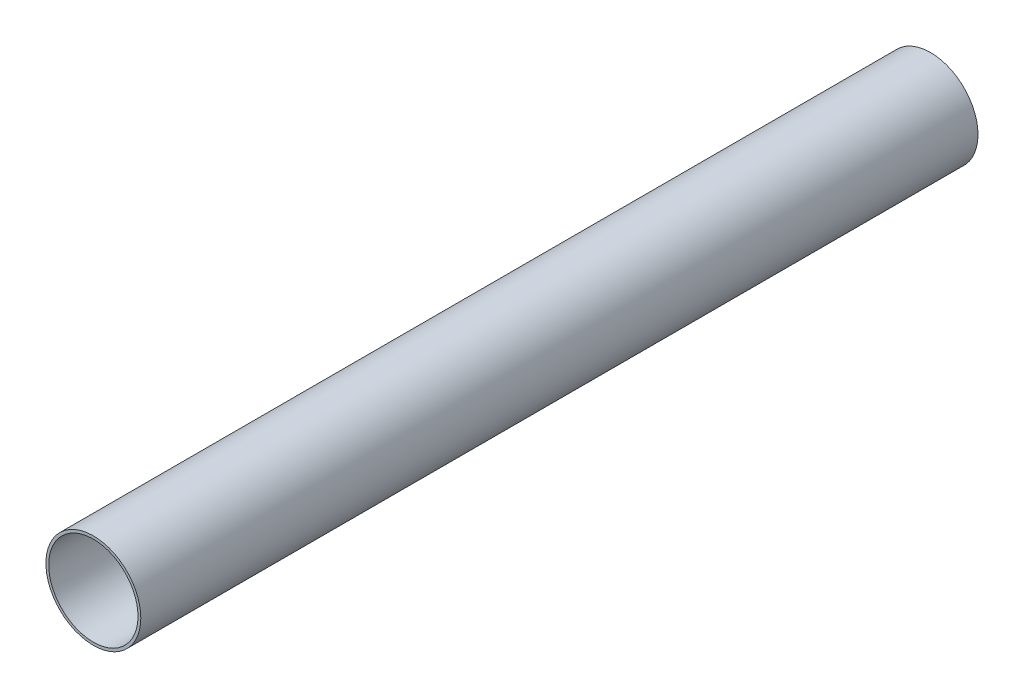
ISO-10303-21;
HEADER;
FILE_DESCRIPTION(('STEP AP214'),'2;1');
FILE_NAME('part.step','',(''),(''),'','','');
FILE_SCHEMA(('AUTOMOTIVE_DESIGN { 1 0 10303 214 1 1 1 1 }'));
ENDSEC;
DATA;
#1=APPLICATION_CONTEXT('core data for automotive mechanical design processes');
#2=APPLICATION_PROTOCOL_DEFINITION('international standard','automotive_design',2000,#1);
#3=PRODUCT_CONTEXT('',#1,'mechanical');
#4=PRODUCT('Part','Part','',(#3));
#5=PRODUCT_RELATED_PRODUCT_CATEGORY('part','',(#4));
#6=PRODUCT_DEFINITION_FORMATION('','',#4);
#7=PRODUCT_DEFINITION_CONTEXT('part definition',#1,'design');
#8=PRODUCT_DEFINITION('design','',#6,#7);
#9=PRODUCT_DEFINITION_SHAPE('','',#8);
#10=(LENGTH_UNIT() NAMED_UNIT(*) SI_UNIT(.MILLI.,.METRE.));
#11=(NAMED_UNIT(*) PLANE_ANGLE_UNIT() SI_UNIT($,.RADIAN.));
#12=(NAMED_UNIT(*) SI_UNIT($,.STERADIAN.) SOLID_ANGLE_UNIT());
#13=UNCERTAINTY_MEASURE_WITH_UNIT(LENGTH_MEASURE(1.E-05),#10,'distance_accuracy_value','');
#14=(GEOMETRIC_REPRESENTATION_CONTEXT(3) GLOBAL_UNCERTAINTY_ASSIGNED_CONTEXT((#13)) GLOBAL_UNIT_ASSIGNED_CONTEXT((#10,
#11,#12)) REPRESENTATION_CONTEXT('',''));
#15=CARTESIAN_POINT('',(0.,0.,0.));
#16=DIRECTION('',(0.,0.,1.));
#17=DIRECTION('',(1.,0.,0.));
#18=AXIS2_PLACEMENT_3D('',#15,#16,#17);
#19=CARTESIAN_POINT('',(0.,0.,300.));
#20=DIRECTION('',(0.,0.,1.));
#21=DIRECTION('',(1.,0.,0.));
#22=AXIS2_PLACEMENT_3D('',#19,#20,#21);
#23=PLANE('',#22);
#24=CARTESIAN_POINT('',(0.,0.,300.));
#25=DIRECTION('',(0.,0.,1.));
#26=DIRECTION('',(1.,0.,0.));
#27=AXIS2_PLACEMENT_3D('',#24,#25,#26);
#28=CIRCLE('',#27,17.);
#29=CARTESIAN_POINT('',(17.,0.,300.));
#30=VERTEX_POINT('',#29);
#31=EDGE_CURVE('E10',#30,#30,#28,.T.);
#32=ORIENTED_EDGE('',*,*,#31,.T.);
#33=EDGE_LOOP('',(#32));
#34=FACE_BOUND('',#33,.T.);
#35=CARTESIAN_POINT('',(0.,0.,300.));
#36=DIRECTION('',(0.,0.,1.));
#37=DIRECTION('',(1.,0.,0.));
#38=AXIS2_PLACEMENT_3D('',#35,#36,#37);
#39=CIRCLE('',#38,16.);
#40=CARTESIAN_POINT('',(16.,0.,300.));
#41=VERTEX_POINT('',#40);
#42=EDGE_CURVE('E42',#41,#41,#39,.T.);
#43=ORIENTED_EDGE('',*,*,#42,.F.);
#44=EDGE_LOOP('',(#43));
#45=FACE_BOUND('',#44,.T.);
#46=ADVANCED_FACE('F31',(#34,#45),#23,.T.);
#47=CARTESIAN_POINT('',(0.,0.,0.));
#48=DIRECTION('',(0.,0.,1.));
#49=DIRECTION('',(1.,0.,0.));
#50=AXIS2_PLACEMENT_3D('',#47,#48,#49);
#51=PLANE('',#50);
#52=CARTESIAN_POINT('',(0.,0.,0.));
#53=DIRECTION('',(0.,0.,1.));
#54=DIRECTION('',(1.,0.,0.));
#55=AXIS2_PLACEMENT_3D('',#52,#53,#54);
#56=CIRCLE('',#55,17.);
#57=CARTESIAN_POINT('',(17.,0.,0.));
#58=VERTEX_POINT('',#57);
#59=EDGE_CURVE('E35',#58,#58,#56,.T.);
#60=ORIENTED_EDGE('',*,*,#59,.F.);
#61=EDGE_LOOP('',(#60));
#62=FACE_BOUND('',#61,.T.);
#63=CARTESIAN_POINT('',(0.,0.,0.));
#64=DIRECTION('',(0.,0.,1.));
#65=DIRECTION('',(1.,0.,0.));
#66=AXIS2_PLACEMENT_3D('',#63,#64,#65);
#67=CIRCLE('',#66,16.);
#68=CARTESIAN_POINT('',(16.,0.,0.));
#69=VERTEX_POINT('',#68);
#70=EDGE_CURVE('E44',#69,#69,#67,.T.);
#71=ORIENTED_EDGE('',*,*,#70,.T.);
#72=EDGE_LOOP('',(#71));
#73=FACE_BOUND('',#72,.T.);
#74=ADVANCED_FACE('F54',(#62,#73),#51,.F.);
#75=CARTESIAN_POINT('',(0.,0.,300.));
#76=DIRECTION('',(0.,0.,-1.));
#77=DIRECTION('',(-1.,0.,0.));
#78=AXIS2_PLACEMENT_3D('',#75,#76,#77);
#79=CYLINDRICAL_SURFACE('',#78,17.);
#80=ORIENTED_EDGE('',*,*,#31,.F.);
#81=EDGE_LOOP('',(#80));
#82=FACE_BOUND('',#81,.T.);
#83=ORIENTED_EDGE('',*,*,#59,.T.);
#84=EDGE_LOOP('',(#83));
#85=FACE_BOUND('',#84,.T.);
#86=ADVANCED_FACE('F33',(#82,#85),#79,.T.);
#87=CARTESIAN_POINT('',(0.,0.,300.));
#88=DIRECTION('',(0.,0.,-1.));
#89=DIRECTION('',(-1.,0.,0.));
#90=AXIS2_PLACEMENT_3D('',#87,#88,#89);
#91=CYLINDRICAL_SURFACE('',#90,16.);
#92=ORIENTED_EDGE('',*,*,#42,.T.);
#93=EDGE_LOOP('',(#92));
#94=FACE_BOUND('',#93,.T.);
#95=ORIENTED_EDGE('',*,*,#70,.F.);
#96=EDGE_LOOP('',(#95));
#97=FACE_BOUND('',#96,.T.);
#98=ADVANCED_FACE('F50',(#94,#97),#91,.F.);
#99=CLOSED_SHELL('',(#46,#74,#86,#98));
#100=MANIFOLD_SOLID_BREP('B2',#99);
#101=ADVANCED_BREP_SHAPE_REPRESENTATION('',(#18,#100),#14);
#102=SHAPE_DEFINITION_REPRESENTATION(#9,#101);
ENDSEC;
END-ISO-10303-21;
